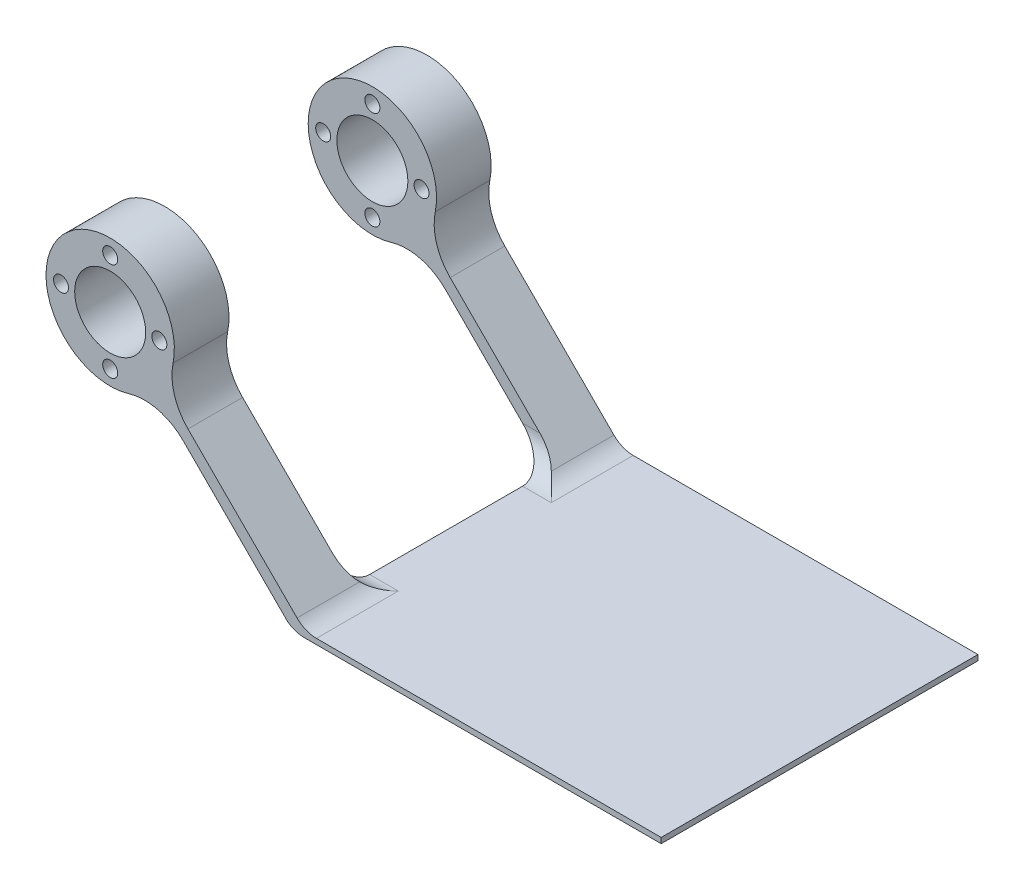
ISO-10303-21;
HEADER;
FILE_DESCRIPTION(('STEP AP214'),'2;1');
FILE_NAME('part.step','',(''),(''),'','','');
FILE_SCHEMA(('AUTOMOTIVE_DESIGN { 1 0 10303 214 1 1 1 1 }'));
ENDSEC;
DATA;
#1=APPLICATION_CONTEXT('core data for automotive mechanical design processes');
#2=APPLICATION_PROTOCOL_DEFINITION('international standard','automotive_design',2000,#1);
#3=PRODUCT_CONTEXT('',#1,'mechanical');
#4=PRODUCT('Part','Part','',(#3));
#5=PRODUCT_RELATED_PRODUCT_CATEGORY('part','',(#4));
#6=PRODUCT_DEFINITION_FORMATION('','',#4);
#7=PRODUCT_DEFINITION_CONTEXT('part definition',#1,'design');
#8=PRODUCT_DEFINITION('design','',#6,#7);
#9=PRODUCT_DEFINITION_SHAPE('','',#8);
#10=(LENGTH_UNIT() NAMED_UNIT(*) SI_UNIT(.MILLI.,.METRE.));
#11=(NAMED_UNIT(*) PLANE_ANGLE_UNIT() SI_UNIT($,.RADIAN.));
#12=(NAMED_UNIT(*) SI_UNIT($,.STERADIAN.) SOLID_ANGLE_UNIT());
#13=UNCERTAINTY_MEASURE_WITH_UNIT(LENGTH_MEASURE(1.E-05),#10,'distance_accuracy_value','');
#14=(GEOMETRIC_REPRESENTATION_CONTEXT(3) GLOBAL_UNCERTAINTY_ASSIGNED_CONTEXT((#13)) GLOBAL_UNIT_ASSIGNED_CONTEXT((#10,
#11,#12)) REPRESENTATION_CONTEXT('',''));
#15=CARTESIAN_POINT('',(0.,0.,0.));
#16=DIRECTION('',(0.,0.,1.));
#17=DIRECTION('',(1.,0.,0.));
#18=AXIS2_PLACEMENT_3D('',#15,#16,#17);
#19=CARTESIAN_POINT('',(-178.87788491269,85.7161894697562,58.));
#20=DIRECTION('',(0.,0.,-1.));
#21=DIRECTION('',(-1.,0.,0.));
#22=AXIS2_PLACEMENT_3D('',#19,#20,#21);
#23=CYLINDRICAL_SURFACE('',#22,2.75000000000001);
#24=CARTESIAN_POINT('',(-178.87788491269,85.7161894697562,-58.));
#25=DIRECTION('',(0.,0.,1.));
#26=DIRECTION('',(1.,0.,0.));
#27=AXIS2_PLACEMENT_3D('',#24,#25,#26);
#28=CIRCLE('',#27,2.75000000000001);
#29=CARTESIAN_POINT('',(-176.12788491269,85.7161894697562,-58.));
#30=VERTEX_POINT('',#29);
#31=EDGE_CURVE('E406',#30,#30,#28,.T.);
#32=ORIENTED_EDGE('',*,*,#31,.F.);
#33=EDGE_LOOP('',(#32));
#34=FACE_BOUND('',#33,.T.);
#35=CARTESIAN_POINT('',(-178.87788491269,85.7161894697562,-38.));
#36=DIRECTION('',(0.,0.,1.));
#37=DIRECTION('',(1.,0.,0.));
#38=AXIS2_PLACEMENT_3D('',#35,#36,#37);
#39=CIRCLE('',#38,2.75000000000001);
#40=CARTESIAN_POINT('',(-176.12788491269,85.7161894697562,-38.));
#41=VERTEX_POINT('',#40);
#42=EDGE_CURVE('E512',#41,#41,#39,.T.);
#43=ORIENTED_EDGE('',*,*,#42,.T.);
#44=EDGE_LOOP('',(#43));
#45=FACE_BOUND('',#44,.T.);
#46=ADVANCED_FACE('F50',(#34,#45),#23,.F.);
#47=CARTESIAN_POINT('',(-160.877883682054,67.7161882391197,58.));
#48=DIRECTION('',(0.,0.,-1.));
#49=DIRECTION('',(-1.,0.,0.));
#50=AXIS2_PLACEMENT_3D('',#47,#48,#49);
#51=CYLINDRICAL_SURFACE('',#50,2.75000000000001);
#52=CARTESIAN_POINT('',(-160.877883682054,67.7161882391197,-58.));
#53=DIRECTION('',(0.,0.,1.));
#54=DIRECTION('',(1.,0.,0.));
#55=AXIS2_PLACEMENT_3D('',#52,#53,#54);
#56=CIRCLE('',#55,2.75000000000001);
#57=CARTESIAN_POINT('',(-158.127883682054,67.7161882391197,-58.));
#58=VERTEX_POINT('',#57);
#59=EDGE_CURVE('E403',#58,#58,#56,.T.);
#60=ORIENTED_EDGE('',*,*,#59,.F.);
#61=EDGE_LOOP('',(#60));
#62=FACE_BOUND('',#61,.T.);
#63=CARTESIAN_POINT('',(-160.877883682054,67.7161882391197,-38.));
#64=DIRECTION('',(0.,0.,1.));
#65=DIRECTION('',(1.,0.,0.));
#66=AXIS2_PLACEMENT_3D('',#63,#64,#65);
#67=CIRCLE('',#66,2.75000000000001);
#68=CARTESIAN_POINT('',(-158.127883682054,67.7161882391197,-38.));
#69=VERTEX_POINT('',#68);
#70=EDGE_CURVE('E509',#69,#69,#67,.T.);
#71=ORIENTED_EDGE('',*,*,#70,.T.);
#72=EDGE_LOOP('',(#71));
#73=FACE_BOUND('',#72,.T.);
#74=ADVANCED_FACE('F356',(#62,#73),#51,.F.);
#75=CARTESIAN_POINT('',(-178.877882451739,49.7161894697563,58.));
#76=DIRECTION('',(0.,0.,-1.));
#77=DIRECTION('',(-1.,0.,0.));
#78=AXIS2_PLACEMENT_3D('',#75,#76,#77);
#79=CYLINDRICAL_SURFACE('',#78,2.75000000000001);
#80=CARTESIAN_POINT('',(-178.877882451739,49.7161894697563,-58.));
#81=DIRECTION('',(0.,0.,1.));
#82=DIRECTION('',(1.,0.,0.));
#83=AXIS2_PLACEMENT_3D('',#80,#81,#82);
#84=CIRCLE('',#83,2.75000000000001);
#85=CARTESIAN_POINT('',(-176.127882451739,49.7161894697563,-58.));
#86=VERTEX_POINT('',#85);
#87=EDGE_CURVE('E400',#86,#86,#84,.T.);
#88=ORIENTED_EDGE('',*,*,#87,.F.);
#89=EDGE_LOOP('',(#88));
#90=FACE_BOUND('',#89,.T.);
#91=CARTESIAN_POINT('',(-178.877882451739,49.7161894697563,-38.));
#92=DIRECTION('',(0.,0.,1.));
#93=DIRECTION('',(1.,0.,0.));
#94=AXIS2_PLACEMENT_3D('',#91,#92,#93);
#95=CIRCLE('',#94,2.75000000000001);
#96=CARTESIAN_POINT('',(-176.127882451739,49.7161894697563,-38.));
#97=VERTEX_POINT('',#96);
#98=EDGE_CURVE('E506',#97,#97,#95,.T.);
#99=ORIENTED_EDGE('',*,*,#98,.T.);
#100=EDGE_LOOP('',(#99));
#101=FACE_BOUND('',#100,.T.);
#102=ADVANCED_FACE('F363',(#90,#101),#79,.F.);
#103=CARTESIAN_POINT('',(-178.877883682054,67.7161894697563,58.));
#104=DIRECTION('',(0.,0.,-1.));
#105=DIRECTION('',(-1.,0.,0.));
#106=AXIS2_PLACEMENT_3D('',#103,#104,#105);
#107=CYLINDRICAL_SURFACE('',#106,13.);
#108=CARTESIAN_POINT('',(-178.877883682054,67.7161894697563,-58.));
#109=DIRECTION('',(0.,0.,1.));
#110=DIRECTION('',(1.,0.,0.));
#111=AXIS2_PLACEMENT_3D('',#108,#109,#110);
#112=CIRCLE('',#111,13.);
#113=CARTESIAN_POINT('',(-165.877883682054,67.7161894697563,-58.));
#114=VERTEX_POINT('',#113);
#115=EDGE_CURVE('E397',#114,#114,#112,.T.);
#116=ORIENTED_EDGE('',*,*,#115,.F.);
#117=EDGE_LOOP('',(#116));
#118=FACE_BOUND('',#117,.T.);
#119=CARTESIAN_POINT('',(-178.877883682054,67.7161894697563,-38.));
#120=DIRECTION('',(0.,0.,1.));
#121=DIRECTION('',(1.,0.,0.));
#122=AXIS2_PLACEMENT_3D('',#119,#120,#121);
#123=CIRCLE('',#122,13.);
#124=CARTESIAN_POINT('',(-165.877883682054,67.7161894697563,-38.));
#125=VERTEX_POINT('',#124);
#126=EDGE_CURVE('E499',#125,#125,#123,.T.);
#127=ORIENTED_EDGE('',*,*,#126,.T.);
#128=EDGE_LOOP('',(#127));
#129=FACE_BOUND('',#128,.T.);
#130=ADVANCED_FACE('F692',(#118,#129),#107,.F.);
#131=CARTESIAN_POINT('',(-178.877883682054,67.7161894697563,58.));
#132=DIRECTION('',(0.,0.,-1.));
#133=DIRECTION('',(-1.,0.,0.));
#134=AXIS2_PLACEMENT_3D('',#131,#132,#133);
#135=CYLINDRICAL_SURFACE('',#134,23.5);
#136=CARTESIAN_POINT('',(-178.877883682054,67.7161894697563,-38.));
#137=DIRECTION('',(0.,0.,1.));
#138=DIRECTION('',(1.,0.,0.));
#139=AXIS2_PLACEMENT_3D('',#136,#137,#138);
#140=CIRCLE('',#139,23.5);
#141=CARTESIAN_POINT('',(-155.851600556006,63.0214812361088,-38.));
#142=VERTEX_POINT('',#141);
#143=CARTESIAN_POINT('',(-172.056221602151,45.2280831362383,-38.));
#144=VERTEX_POINT('',#143);
#145=EDGE_CURVE('E495',#142,#144,#140,.T.);
#146=ORIENTED_EDGE('',*,*,#145,.F.);
#147=DIRECTION('',(0.,0.,-1.));
#148=VECTOR('',#147,1.);
#149=CARTESIAN_POINT('',(-155.851600556006,63.0214812361088,58.));
#150=LINE('',#149,#148);
#151=CARTESIAN_POINT('',(-155.851600556006,63.0214812361088,-58.));
#152=VERTEX_POINT('',#151);
#153=EDGE_CURVE('E297',#142,#152,#150,.T.);
#154=ORIENTED_EDGE('',*,*,#153,.T.);
#155=CARTESIAN_POINT('',(-178.877883682054,67.7161894697563,-58.));
#156=DIRECTION('',(0.,0.,1.));
#157=DIRECTION('',(1.,0.,0.));
#158=AXIS2_PLACEMENT_3D('',#155,#156,#157);
#159=CIRCLE('',#158,23.5);
#160=CARTESIAN_POINT('',(-172.056221602151,45.2280831362383,-58.));
#161=VERTEX_POINT('',#160);
#162=EDGE_CURVE('E290',#152,#161,#159,.T.);
#163=ORIENTED_EDGE('',*,*,#162,.T.);
#164=DIRECTION('',(0.,0.,-1.));
#165=VECTOR('',#164,1.);
#166=CARTESIAN_POINT('',(-172.056221602151,45.2280831362383,58.));
#167=LINE('',#166,#165);
#168=EDGE_CURVE('E299',#161,#144,#167,.F.);
#169=ORIENTED_EDGE('',*,*,#168,.T.);
#170=EDGE_LOOP('',(#146,#154,#163,#169));
#171=FACE_BOUND('',#170,.T.);
#172=ADVANCED_FACE('F379',(#171),#135,.T.);
#173=CARTESIAN_POINT('',(-196.877883682054,67.7161907000702,58.));
#174=DIRECTION('',(0.,0.,-1.));
#175=DIRECTION('',(-1.,0.,0.));
#176=AXIS2_PLACEMENT_3D('',#173,#174,#175);
#177=CYLINDRICAL_SURFACE('',#176,2.75000000000001);
#178=CARTESIAN_POINT('',(-196.877883682054,67.7161907000702,-58.));
#179=DIRECTION('',(0.,0.,1.));
#180=DIRECTION('',(1.,0.,0.));
#181=AXIS2_PLACEMENT_3D('',#178,#179,#180);
#182=CIRCLE('',#181,2.75000000000001);
#183=CARTESIAN_POINT('',(-194.127883682054,67.7161907000702,-58.));
#184=VERTEX_POINT('',#183);
#185=EDGE_CURVE('E409',#184,#184,#182,.T.);
#186=ORIENTED_EDGE('',*,*,#185,.F.);
#187=EDGE_LOOP('',(#186));
#188=FACE_BOUND('',#187,.T.);
#189=CARTESIAN_POINT('',(-196.877883682054,67.7161907000702,-38.));
#190=DIRECTION('',(0.,0.,1.));
#191=DIRECTION('',(1.,0.,0.));
#192=AXIS2_PLACEMENT_3D('',#189,#190,#191);
#193=CIRCLE('',#192,2.75000000000001);
#194=CARTESIAN_POINT('',(-194.127883682054,67.7161907000702,-38.));
#195=VERTEX_POINT('',#194);
#196=EDGE_CURVE('E496',#195,#195,#193,.T.);
#197=ORIENTED_EDGE('',*,*,#196,.T.);
#198=EDGE_LOOP('',(#197));
#199=FACE_BOUND('',#198,.T.);
#200=ADVANCED_FACE('F371',(#188,#199),#177,.F.);
#201=CARTESIAN_POINT('',(-178.87788491269,85.7161894697562,58.));
#202=DIRECTION('',(0.,0.,1.));
#203=DIRECTION('',(1.,0.,0.));
#204=AXIS2_PLACEMENT_3D('',#201,#202,#203);
#205=CIRCLE('',#204,2.75000000000001);
#206=CARTESIAN_POINT('',(-176.12788491269,85.7161894697562,58.));
#207=VERTEX_POINT('',#206);
#208=EDGE_CURVE('E385',#207,#207,#205,.T.);
#209=ORIENTED_EDGE('',*,*,#208,.T.);
#210=EDGE_LOOP('',(#209));
#211=FACE_BOUND('',#210,.T.);
#212=CARTESIAN_POINT('',(-178.87788491269,85.7161894697562,38.));
#213=DIRECTION('',(0.,0.,-1.));
#214=DIRECTION('',(-1.,0.,0.));
#215=AXIS2_PLACEMENT_3D('',#212,#213,#214);
#216=CIRCLE('',#215,2.75000000000001);
#217=CARTESIAN_POINT('',(-181.62788491269,85.7161894697562,38.));
#218=VERTEX_POINT('',#217);
#219=EDGE_CURVE('E291',#218,#218,#216,.T.);
#220=ORIENTED_EDGE('',*,*,#219,.T.);
#221=EDGE_LOOP('',(#220));
#222=FACE_BOUND('',#221,.T.);
#223=ADVANCED_FACE('F359',(#211,#222),#23,.F.);
#224=CARTESIAN_POINT('',(-160.877883682054,67.7161882391197,58.));
#225=DIRECTION('',(0.,0.,1.));
#226=DIRECTION('',(1.,0.,0.));
#227=AXIS2_PLACEMENT_3D('',#224,#225,#226);
#228=CIRCLE('',#227,2.75000000000001);
#229=CARTESIAN_POINT('',(-158.127883682054,67.7161882391197,58.));
#230=VERTEX_POINT('',#229);
#231=EDGE_CURVE('E430',#230,#230,#228,.T.);
#232=ORIENTED_EDGE('',*,*,#231,.T.);
#233=EDGE_LOOP('',(#232));
#234=FACE_BOUND('',#233,.T.);
#235=CARTESIAN_POINT('',(-160.877883682054,67.7161882391197,38.));
#236=DIRECTION('',(0.,0.,-1.));
#237=DIRECTION('',(-1.,0.,0.));
#238=AXIS2_PLACEMENT_3D('',#235,#236,#237);
#239=CIRCLE('',#238,2.75000000000001);
#240=CARTESIAN_POINT('',(-163.627883682054,67.7161882391197,38.));
#241=VERTEX_POINT('',#240);
#242=EDGE_CURVE('E388',#241,#241,#239,.T.);
#243=ORIENTED_EDGE('',*,*,#242,.T.);
#244=EDGE_LOOP('',(#243));
#245=FACE_BOUND('',#244,.T.);
#246=ADVANCED_FACE('F366',(#234,#245),#51,.F.);
#247=CARTESIAN_POINT('',(-178.877882451739,49.7161894697563,58.));
#248=DIRECTION('',(0.,0.,1.));
#249=DIRECTION('',(1.,0.,0.));
#250=AXIS2_PLACEMENT_3D('',#247,#248,#249);
#251=CIRCLE('',#250,2.75000000000001);
#252=CARTESIAN_POINT('',(-176.127882451739,49.7161894697563,58.));
#253=VERTEX_POINT('',#252);
#254=EDGE_CURVE('E427',#253,#253,#251,.T.);
#255=ORIENTED_EDGE('',*,*,#254,.T.);
#256=EDGE_LOOP('',(#255));
#257=FACE_BOUND('',#256,.T.);
#258=CARTESIAN_POINT('',(-178.877882451739,49.7161894697563,38.));
#259=DIRECTION('',(0.,0.,-1.));
#260=DIRECTION('',(-1.,0.,0.));
#261=AXIS2_PLACEMENT_3D('',#258,#259,#260);
#262=CIRCLE('',#261,2.75000000000001);
#263=CARTESIAN_POINT('',(-181.62788245174,49.7161894697563,38.));
#264=VERTEX_POINT('',#263);
#265=EDGE_CURVE('E391',#264,#264,#262,.T.);
#266=ORIENTED_EDGE('',*,*,#265,.T.);
#267=EDGE_LOOP('',(#266));
#268=FACE_BOUND('',#267,.T.);
#269=ADVANCED_FACE('F377',(#257,#268),#79,.F.);
#270=CARTESIAN_POINT('',(-178.877883682054,67.7161894697563,58.));
#271=DIRECTION('',(0.,0.,1.));
#272=DIRECTION('',(1.,0.,0.));
#273=AXIS2_PLACEMENT_3D('',#270,#271,#272);
#274=CIRCLE('',#273,13.);
#275=CARTESIAN_POINT('',(-165.877883682054,67.7161894697563,58.));
#276=VERTEX_POINT('',#275);
#277=EDGE_CURVE('E424',#276,#276,#274,.T.);
#278=ORIENTED_EDGE('',*,*,#277,.T.);
#279=EDGE_LOOP('',(#278));
#280=FACE_BOUND('',#279,.T.);
#281=CARTESIAN_POINT('',(-178.877883682054,67.7161894697563,38.));
#282=DIRECTION('',(0.,0.,-1.));
#283=DIRECTION('',(-1.,0.,0.));
#284=AXIS2_PLACEMENT_3D('',#281,#282,#283);
#285=CIRCLE('',#284,13.);
#286=CARTESIAN_POINT('',(-191.877883682054,67.7161894697563,38.));
#287=VERTEX_POINT('',#286);
#288=EDGE_CURVE('E519',#287,#287,#285,.T.);
#289=ORIENTED_EDGE('',*,*,#288,.T.);
#290=EDGE_LOOP('',(#289));
#291=FACE_BOUND('',#290,.T.);
#292=ADVANCED_FACE('F540',(#280,#291),#107,.F.);
#293=CARTESIAN_POINT('',(-178.877883682054,67.7161894697563,38.));
#294=DIRECTION('',(0.,0.,-1.));
#295=DIRECTION('',(-1.,0.,0.));
#296=AXIS2_PLACEMENT_3D('',#293,#294,#295);
#297=CIRCLE('',#296,23.5);
#298=CARTESIAN_POINT('',(-172.056221602151,45.2280831362383,38.));
#299=VERTEX_POINT('',#298);
#300=CARTESIAN_POINT('',(-155.851600556006,63.0214812361088,38.));
#301=VERTEX_POINT('',#300);
#302=EDGE_CURVE('E334',#299,#301,#297,.T.);
#303=ORIENTED_EDGE('',*,*,#302,.F.);
#304=DIRECTION('',(0.,0.,-1.));
#305=VECTOR('',#304,1.);
#306=CARTESIAN_POINT('',(-172.056221602151,45.2280831362383,58.));
#307=LINE('',#306,#305);
#308=CARTESIAN_POINT('',(-172.056221602151,45.2280831362383,58.));
#309=VERTEX_POINT('',#308);
#310=EDGE_CURVE('E302',#299,#309,#307,.F.);
#311=ORIENTED_EDGE('',*,*,#310,.T.);
#312=CARTESIAN_POINT('',(-178.877883682054,67.7161894697563,58.));
#313=DIRECTION('',(0.,0.,1.));
#314=DIRECTION('',(1.,0.,0.));
#315=AXIS2_PLACEMENT_3D('',#312,#313,#314);
#316=CIRCLE('',#315,23.5);
#317=CARTESIAN_POINT('',(-155.851600556006,63.0214812361088,58.));
#318=VERTEX_POINT('',#317);
#319=EDGE_CURVE('E418',#318,#309,#316,.T.);
#320=ORIENTED_EDGE('',*,*,#319,.F.);
#321=DIRECTION('',(0.,0.,-1.));
#322=VECTOR('',#321,1.);
#323=CARTESIAN_POINT('',(-155.851600556006,63.0214812361088,58.));
#324=LINE('',#323,#322);
#325=EDGE_CURVE('E294',#318,#301,#324,.T.);
#326=ORIENTED_EDGE('',*,*,#325,.T.);
#327=EDGE_LOOP('',(#303,#311,#320,#326));
#328=FACE_BOUND('',#327,.T.);
#329=ADVANCED_FACE('F533',(#328),#135,.T.);
#330=CARTESIAN_POINT('',(-196.877883682054,67.7161907000702,58.));
#331=DIRECTION('',(0.,0.,1.));
#332=DIRECTION('',(1.,0.,0.));
#333=AXIS2_PLACEMENT_3D('',#330,#331,#332);
#334=CIRCLE('',#333,2.75000000000001);
#335=CARTESIAN_POINT('',(-194.127883682054,67.7161907000702,58.));
#336=VERTEX_POINT('',#335);
#337=EDGE_CURVE('E434',#336,#336,#334,.T.);
#338=ORIENTED_EDGE('',*,*,#337,.T.);
#339=EDGE_LOOP('',(#338));
#340=FACE_BOUND('',#339,.T.);
#341=CARTESIAN_POINT('',(-196.877883682054,67.7161907000702,38.));
#342=DIRECTION('',(0.,0.,-1.));
#343=DIRECTION('',(-1.,0.,0.));
#344=AXIS2_PLACEMENT_3D('',#341,#342,#343);
#345=CIRCLE('',#344,2.75000000000001);
#346=CARTESIAN_POINT('',(-199.627883682054,67.7161907000702,38.));
#347=VERTEX_POINT('',#346);
#348=EDGE_CURVE('E516',#347,#347,#345,.T.);
#349=ORIENTED_EDGE('',*,*,#348,.T.);
#350=EDGE_LOOP('',(#349));
#351=FACE_BOUND('',#350,.T.);
#352=ADVANCED_FACE('F381',(#340,#351),#177,.F.);
#353=CARTESIAN_POINT('',(-104.204998804833,2.,-13.7426971214017));
#354=DIRECTION('',(0.,1.,0.));
#355=DIRECTION('',(0.,0.,1.));
#356=AXIS2_PLACEMENT_3D('',#353,#354,#355);
#357=PLANE('',#356);
#358=DIRECTION('',(0.,0.,1.));
#359=VECTOR('',#358,1.);
#360=CARTESIAN_POINT('',(-113.87701126408,2.,58.));
#361=LINE('',#360,#359);
#362=CARTESIAN_POINT('',(-113.87701126408,2.,-28.));
#363=VERTEX_POINT('',#362);
#364=CARTESIAN_POINT('',(-113.87701126408,2.,22.8031981799006));
#365=VERTEX_POINT('',#364);
#366=EDGE_CURVE('E230',#363,#365,#361,.T.);
#367=ORIENTED_EDGE('',*,*,#366,.T.);
#368=CARTESIAN_POINT('',(-113.87701126408,2.,28.));
#369=VERTEX_POINT('',#368);
#370=EDGE_CURVE('E237',#365,#369,#361,.T.);
#371=ORIENTED_EDGE('',*,*,#370,.T.);
#372=DIRECTION('',(1.,0.,0.));
#373=VECTOR('',#372,1.);
#374=CARTESIAN_POINT('',(-104.204998804833,2.,28.));
#375=LINE('',#374,#373);
#376=CARTESIAN_POINT('',(-103.37091460967,2.,28.));
#377=VERTEX_POINT('',#376);
#378=EDGE_CURVE('E259',#369,#377,#375,.T.);
#379=ORIENTED_EDGE('',*,*,#378,.T.);
#380=DIRECTION('',(0.,0.,1.));
#381=VECTOR('',#380,1.);
#382=CARTESIAN_POINT('',(-103.37091460967,2.,58.));
#383=LINE('',#382,#381);
#384=CARTESIAN_POINT('',(-103.37091460967,2.,58.));
#385=VERTEX_POINT('',#384);
#386=EDGE_CURVE('E269',#377,#385,#383,.T.);
#387=ORIENTED_EDGE('',*,*,#386,.T.);
#388=DIRECTION('',(1.,0.,0.));
#389=VECTOR('',#388,1.);
#390=CARTESIAN_POINT('',(113.87701126408,2.,58.));
#391=LINE('',#390,#389);
#392=CARTESIAN_POINT('',(22.8770112640801,2.,58.));
#393=VERTEX_POINT('',#392);
#394=EDGE_CURVE('E236',#385,#393,#391,.T.);
#395=ORIENTED_EDGE('',*,*,#394,.T.);
#396=DIRECTION('',(0.,0.,1.));
#397=VECTOR('',#396,1.);
#398=CARTESIAN_POINT('',(22.8770112640801,2.,58.));
#399=LINE('',#398,#397);
#400=CARTESIAN_POINT('',(22.8770112640801,2.,-58.));
#401=VERTEX_POINT('',#400);
#402=EDGE_CURVE('E200',#401,#393,#399,.T.);
#403=ORIENTED_EDGE('',*,*,#402,.F.);
#404=DIRECTION('',(-1.,0.,0.));
#405=VECTOR('',#404,1.);
#406=CARTESIAN_POINT('',(-113.87701126408,2.,-58.));
#407=LINE('',#406,#405);
#408=CARTESIAN_POINT('',(-103.37091460967,2.,-58.));
#409=VERTEX_POINT('',#408);
#410=EDGE_CURVE('E214',#401,#409,#407,.T.);
#411=ORIENTED_EDGE('',*,*,#410,.T.);
#412=DIRECTION('',(0.,0.,-1.));
#413=VECTOR('',#412,1.);
#414=CARTESIAN_POINT('',(-103.37091460967,2.,-13.7426971214017));
#415=LINE('',#414,#413);
#416=CARTESIAN_POINT('',(-103.37091460967,2.,-28.));
#417=VERTEX_POINT('',#416);
#418=EDGE_CURVE('E233',#409,#417,#415,.F.);
#419=ORIENTED_EDGE('',*,*,#418,.T.);
#420=DIRECTION('',(-1.,0.,0.));
#421=VECTOR('',#420,1.);
#422=CARTESIAN_POINT('',(-104.204998804833,2.,-28.));
#423=LINE('',#422,#421);
#424=EDGE_CURVE('E222',#417,#363,#423,.T.);
#425=ORIENTED_EDGE('',*,*,#424,.T.);
#426=EDGE_LOOP('',(#367,#371,#379,#387,#395,#403,#411,#419,#425));
#427=FACE_BOUND('',#426,.T.);
#428=ADVANCED_FACE('F229',(#427),#357,.T.);
#429=CARTESIAN_POINT('',(-113.87701126408,2.,38.));
#430=DIRECTION('',(-0.707106781186543,-0.707106781186552,0.));
#431=DIRECTION('',(0.707106781186552,-0.707106781186543,0.));
#432=AXIS2_PLACEMENT_3D('',#429,#430,#431);
#433=PLANE('',#432);
#434=DIRECTION('',(0.707106781186552,-0.707106781186543,0.));
#435=VECTOR('',#434,1.);
#436=CARTESIAN_POINT('',(-113.87701126408,2.,58.));
#437=LINE('',#436,#435);
#438=CARTESIAN_POINT('',(-152.108416123184,40.231404859103,58.));
#439=VERTEX_POINT('',#438);
#440=CARTESIAN_POINT('',(-113.87701126408,2.,58.));
#441=VERTEX_POINT('',#440);
#442=EDGE_CURVE('E341',#439,#441,#437,.T.);
#443=ORIENTED_EDGE('',*,*,#442,.F.);
#444=DIRECTION('',(0.,0.,-1.));
#445=VECTOR('',#444,1.);
#446=CARTESIAN_POINT('',(-152.108416123184,40.231404859103,38.));
#447=LINE('',#446,#445);
#448=CARTESIAN_POINT('',(-152.108416123184,40.231404859103,38.));
#449=VERTEX_POINT('',#448);
#450=EDGE_CURVE('E287',#439,#449,#447,.T.);
#451=ORIENTED_EDGE('',*,*,#450,.T.);
#452=DIRECTION('',(0.707106781186552,-0.707106781186543,0.));
#453=VECTOR('',#452,1.);
#454=CARTESIAN_POINT('',(-113.87701126408,2.,38.));
#455=LINE('',#454,#453);
#456=CARTESIAN_POINT('',(-123.87701126408,12.,38.));
#457=VERTEX_POINT('',#456);
#458=EDGE_CURVE('E340',#449,#457,#455,.T.);
#459=ORIENTED_EDGE('',*,*,#458,.T.);
#460=CARTESIAN_POINT('',(-123.87701126408,12.,28.));
#461=DIRECTION('',(-0.707106781186543,-0.707106781186552,0.));
#462=DIRECTION('',(0.707106781186552,-0.707106781186543,0.));
#463=AXIS2_PLACEMENT_3D('',#460,#461,#462);
#464=ELLIPSE('',#463,14.142135623731,10.);
#465=EDGE_CURVE('E266',#457,#369,#464,.F.);
#466=ORIENTED_EDGE('',*,*,#465,.T.);
#467=DIRECTION('',(0.,0.,1.));
#468=VECTOR('',#467,1.);
#469=CARTESIAN_POINT('',(-113.87701126408,2.,38.));
#470=LINE('',#469,#468);
#471=EDGE_CURVE('E243',#369,#441,#470,.T.);
#472=ORIENTED_EDGE('',*,*,#471,.T.);
#473=EDGE_LOOP('',(#443,#451,#459,#466,#472));
#474=FACE_BOUND('',#473,.T.);
#475=ADVANCED_FACE('F453',(#474),#433,.T.);
#476=CARTESIAN_POINT('',(-165.695030748741,60.1819805153389,38.));
#477=DIRECTION('',(0.707106781186543,0.707106781186552,0.));
#478=DIRECTION('',(-0.707106781186552,0.707106781186543,0.));
#479=AXIS2_PLACEMENT_3D('',#476,#477,#478);
#480=PLANE('',#479);
#481=DIRECTION('',(-0.707106781186552,0.707106781186543,0.));
#482=VECTOR('',#481,1.);
#483=CARTESIAN_POINT('',(-165.695030748741,60.1819805153389,38.));
#484=LINE('',#483,#482);
#485=CARTESIAN_POINT('',(-117.513050233401,12.,38.));
#486=VERTEX_POINT('',#485);
#487=CARTESIAN_POINT('',(-150.396899476718,44.883849243316,38.));
#488=VERTEX_POINT('',#487);
#489=EDGE_CURVE('E331',#486,#488,#484,.T.);
#490=ORIENTED_EDGE('',*,*,#489,.T.);
#491=DIRECTION('',(0.,0.,-1.));
#492=VECTOR('',#491,1.);
#493=CARTESIAN_POINT('',(-150.396899476718,44.883849243316,38.));
#494=LINE('',#493,#492);
#495=CARTESIAN_POINT('',(-150.396899476718,44.883849243316,58.));
#496=VERTEX_POINT('',#495);
#497=EDGE_CURVE('E309',#488,#496,#494,.F.);
#498=ORIENTED_EDGE('',*,*,#497,.T.);
#499=DIRECTION('',(-0.707106781186552,0.707106781186543,0.));
#500=VECTOR('',#499,1.);
#501=CARTESIAN_POINT('',(-165.695030748741,60.1819805153389,58.));
#502=LINE('',#501,#500);
#503=CARTESIAN_POINT('',(-110.441982421536,4.92893218813449,58.));
#504=VERTEX_POINT('',#503);
#505=EDGE_CURVE('E436',#504,#496,#502,.T.);
#506=ORIENTED_EDGE('',*,*,#505,.F.);
#507=DIRECTION('',(0.,0.,1.));
#508=VECTOR('',#507,1.);
#509=CARTESIAN_POINT('',(-110.441982421536,4.92893218813449,28.));
#510=LINE('',#509,#508);
#511=CARTESIAN_POINT('',(-110.441982421536,4.92893218813449,35.0710678118654));
#512=VERTEX_POINT('',#511);
#513=EDGE_CURVE('E272',#504,#512,#510,.F.);
#514=ORIENTED_EDGE('',*,*,#513,.T.);
#515=CARTESIAN_POINT('',(-117.513050233401,12.,28.));
#516=DIRECTION('',(0.707106781186543,0.707106781186552,0.));
#517=DIRECTION('',(0.707106781186552,-0.707106781186543,0.));
#518=AXIS2_PLACEMENT_3D('',#515,#516,#517);
#519=ELLIPSE('',#518,14.142135623731,10.);
#520=EDGE_CURVE('E264',#512,#486,#519,.F.);
#521=ORIENTED_EDGE('',*,*,#520,.T.);
#522=EDGE_LOOP('',(#490,#498,#506,#514,#521));
#523=FACE_BOUND('',#522,.T.);
#524=ADVANCED_FACE('F336',(#523),#480,.T.);
#525=CARTESIAN_POINT('',(113.87701126408,2.,58.));
#526=DIRECTION('',(0.,0.,-1.));
#527=DIRECTION('',(-1.,0.,0.));
#528=AXIS2_PLACEMENT_3D('',#525,#526,#527);
#529=PLANE('',#528);
#530=DIRECTION('',(1.,0.,0.));
#531=VECTOR('',#530,1.);
#532=CARTESIAN_POINT('',(113.87701126408,0.,58.));
#533=LINE('',#532,#531);
#534=CARTESIAN_POINT('',(-107.87701126408,0.,58.));
#535=VERTEX_POINT('',#534);
#536=CARTESIAN_POINT('',(22.8770112640801,0.,58.));
#537=VERTEX_POINT('',#536);
#538=EDGE_CURVE('E247',#535,#537,#533,.T.);
#539=ORIENTED_EDGE('',*,*,#538,.T.);
#540=DIRECTION('',(0.,1.,0.));
#541=VECTOR('',#540,1.);
#542=CARTESIAN_POINT('',(22.8770112640801,-147.434731322033,58.));
#543=LINE('',#542,#541);
#544=EDGE_CURVE('E65',#537,#393,#543,.T.);
#545=ORIENTED_EDGE('',*,*,#544,.T.);
#546=ORIENTED_EDGE('',*,*,#394,.F.);
#547=CARTESIAN_POINT('',(-103.37091460967,12.,58.));
#548=DIRECTION('',(0.,0.,-1.));
#549=DIRECTION('',(-1.,0.,0.));
#550=AXIS2_PLACEMENT_3D('',#547,#548,#549);
#551=CIRCLE('',#550,10.);
#552=EDGE_CURVE('E274',#385,#504,#551,.T.);
#553=ORIENTED_EDGE('',*,*,#552,.T.);
#554=ORIENTED_EDGE('',*,*,#505,.T.);
#555=CARTESIAN_POINT('',(-136.254763852987,59.0259848670471,58.));
#556=DIRECTION('',(0.,0.,-1.));
#557=DIRECTION('',(-1.,0.,0.));
#558=AXIS2_PLACEMENT_3D('',#555,#556,#557);
#559=CIRCLE('',#558,20.);
#560=EDGE_CURVE('E73',#496,#318,#559,.T.);
#561=ORIENTED_EDGE('',*,*,#560,.T.);
#562=ORIENTED_EDGE('',*,*,#319,.T.);
#563=CARTESIAN_POINT('',(-166.250551746914,26.089269235372,58.));
#564=DIRECTION('',(0.,0.,-1.));
#565=DIRECTION('',(-1.,0.,0.));
#566=AXIS2_PLACEMENT_3D('',#563,#564,#565);
#567=CIRCLE('',#566,20.);
#568=EDGE_CURVE('E313',#309,#439,#567,.T.);
#569=ORIENTED_EDGE('',*,*,#568,.T.);
#570=ORIENTED_EDGE('',*,*,#442,.T.);
#571=CARTESIAN_POINT('',(-107.87701126408,10.,58.));
#572=DIRECTION('',(0.,0.,-1.));
#573=DIRECTION('',(-1.,0.,0.));
#574=AXIS2_PLACEMENT_3D('',#571,#572,#573);
#575=CIRCLE('',#574,10.);
#576=EDGE_CURVE('E257',#441,#535,#575,.F.);
#577=ORIENTED_EDGE('',*,*,#576,.T.);
#578=EDGE_LOOP('',(#539,#545,#546,#553,#554,#561,#562,#569,#570,#577));
#579=FACE_BOUND('',#578,.T.);
#580=ORIENTED_EDGE('',*,*,#277,.F.);
#581=EDGE_LOOP('',(#580));
#582=FACE_BOUND('',#581,.T.);
#583=ORIENTED_EDGE('',*,*,#254,.F.);
#584=EDGE_LOOP('',(#583));
#585=FACE_BOUND('',#584,.T.);
#586=ORIENTED_EDGE('',*,*,#231,.F.);
#587=EDGE_LOOP('',(#586));
#588=FACE_BOUND('',#587,.T.);
#589=ORIENTED_EDGE('',*,*,#208,.F.);
#590=EDGE_LOOP('',(#589));
#591=FACE_BOUND('',#590,.T.);
#592=ORIENTED_EDGE('',*,*,#337,.F.);
#593=EDGE_LOOP('',(#592));
#594=FACE_BOUND('',#593,.T.);
#595=ADVANCED_FACE('F442',(#579,#582,#585,#588,#591,#594),#529,.F.);
#596=CARTESIAN_POINT('',(-113.87701126408,2.,-58.));
#597=DIRECTION('',(0.,0.,1.));
#598=DIRECTION('',(1.,0.,0.));
#599=AXIS2_PLACEMENT_3D('',#596,#597,#598);
#600=PLANE('',#599);
#601=ORIENTED_EDGE('',*,*,#410,.F.);
#602=DIRECTION('',(0.,1.,0.));
#603=VECTOR('',#602,1.);
#604=CARTESIAN_POINT('',(22.8770112640801,-147.434731322033,-58.));
#605=LINE('',#604,#603);
#606=CARTESIAN_POINT('',(22.8770112640801,0.,-58.));
#607=VERTEX_POINT('',#606);
#608=EDGE_CURVE('E466',#607,#401,#605,.T.);
#609=ORIENTED_EDGE('',*,*,#608,.F.);
#610=DIRECTION('',(-1.,0.,0.));
#611=VECTOR('',#610,1.);
#612=CARTESIAN_POINT('',(-113.87701126408,0.,-58.));
#613=LINE('',#612,#611);
#614=CARTESIAN_POINT('',(-107.87701126408,0.,-58.));
#615=VERTEX_POINT('',#614);
#616=EDGE_CURVE('E241',#607,#615,#613,.T.);
#617=ORIENTED_EDGE('',*,*,#616,.T.);
#618=CARTESIAN_POINT('',(-107.87701126408,10.,-58.));
#619=DIRECTION('',(0.,0.,1.));
#620=DIRECTION('',(1.,0.,0.));
#621=AXIS2_PLACEMENT_3D('',#618,#619,#620);
#622=CIRCLE('',#621,10.);
#623=CARTESIAN_POINT('',(-113.87701126408,2.,-58.));
#624=VERTEX_POINT('',#623);
#625=EDGE_CURVE('E255',#615,#624,#622,.F.);
#626=ORIENTED_EDGE('',*,*,#625,.T.);
#627=DIRECTION('',(0.707106781186552,-0.707106781186543,0.));
#628=VECTOR('',#627,1.);
#629=CARTESIAN_POINT('',(-113.87701126408,2.,-58.));
#630=LINE('',#629,#628);
#631=CARTESIAN_POINT('',(-152.108416123184,40.231404859103,-58.));
#632=VERTEX_POINT('',#631);
#633=EDGE_CURVE('E211',#632,#624,#630,.T.);
#634=ORIENTED_EDGE('',*,*,#633,.F.);
#635=CARTESIAN_POINT('',(-166.250551746914,26.089269235372,-58.));
#636=DIRECTION('',(0.,0.,1.));
#637=DIRECTION('',(1.,0.,0.));
#638=AXIS2_PLACEMENT_3D('',#635,#636,#637);
#639=CIRCLE('',#638,20.);
#640=EDGE_CURVE('E315',#632,#161,#639,.T.);
#641=ORIENTED_EDGE('',*,*,#640,.T.);
#642=ORIENTED_EDGE('',*,*,#162,.F.);
#643=CARTESIAN_POINT('',(-136.254763852987,59.0259848670471,-58.));
#644=DIRECTION('',(0.,0.,1.));
#645=DIRECTION('',(1.,0.,0.));
#646=AXIS2_PLACEMENT_3D('',#643,#644,#645);
#647=CIRCLE('',#646,20.);
#648=CARTESIAN_POINT('',(-150.396899476718,44.883849243316,-58.));
#649=VERTEX_POINT('',#648);
#650=EDGE_CURVE('E321',#152,#649,#647,.T.);
#651=ORIENTED_EDGE('',*,*,#650,.T.);
#652=DIRECTION('',(-0.707106781186552,0.707106781186543,0.));
#653=VECTOR('',#652,1.);
#654=CARTESIAN_POINT('',(-165.695030748741,60.1819805153389,-58.));
#655=LINE('',#654,#653);
#656=CARTESIAN_POINT('',(-110.441982421536,4.92893218813449,-58.));
#657=VERTEX_POINT('',#656);
#658=EDGE_CURVE('E415',#657,#649,#655,.T.);
#659=ORIENTED_EDGE('',*,*,#658,.F.);
#660=CARTESIAN_POINT('',(-103.37091460967,12.,-58.));
#661=DIRECTION('',(0.,0.,1.));
#662=DIRECTION('',(1.,0.,0.));
#663=AXIS2_PLACEMENT_3D('',#660,#661,#662);
#664=CIRCLE('',#663,10.);
#665=EDGE_CURVE('E284',#657,#409,#664,.T.);
#666=ORIENTED_EDGE('',*,*,#665,.T.);
#667=EDGE_LOOP('',(#601,#609,#617,#626,#634,#641,#642,#651,#659,#666));
#668=FACE_BOUND('',#667,.T.);
#669=ORIENTED_EDGE('',*,*,#185,.T.);
#670=EDGE_LOOP('',(#669));
#671=FACE_BOUND('',#670,.T.);
#672=ORIENTED_EDGE('',*,*,#31,.T.);
#673=EDGE_LOOP('',(#672));
#674=FACE_BOUND('',#673,.T.);
#675=ORIENTED_EDGE('',*,*,#59,.T.);
#676=EDGE_LOOP('',(#675));
#677=FACE_BOUND('',#676,.T.);
#678=ORIENTED_EDGE('',*,*,#87,.T.);
#679=EDGE_LOOP('',(#678));
#680=FACE_BOUND('',#679,.T.);
#681=ORIENTED_EDGE('',*,*,#115,.T.);
#682=EDGE_LOOP('',(#681));
#683=FACE_BOUND('',#682,.T.);
#684=ADVANCED_FACE('F473',(#668,#671,#674,#677,#680,#683),#600,.F.);
#685=CARTESIAN_POINT('',(-104.204998804833,0.,-13.7426971214017));
#686=DIRECTION('',(0.,1.,0.));
#687=DIRECTION('',(0.,0.,1.));
#688=AXIS2_PLACEMENT_3D('',#685,#686,#687);
#689=PLANE('',#688);
#690=DIRECTION('',(0.,0.,1.));
#691=VECTOR('',#690,1.);
#692=CARTESIAN_POINT('',(-107.87701126408,0.,-13.7426971214017));
#693=LINE('',#692,#691);
#694=CARTESIAN_POINT('',(-107.87701126408,0.,22.8031981799006));
#695=VERTEX_POINT('',#694);
#696=EDGE_CURVE('E213',#535,#695,#693,.F.);
#697=ORIENTED_EDGE('',*,*,#696,.T.);
#698=DIRECTION('',(0.,0.,-1.));
#699=VECTOR('',#698,1.);
#700=CARTESIAN_POINT('',(-107.87701126408,0.,-13.7426971214017));
#701=LINE('',#700,#699);
#702=CARTESIAN_POINT('',(-107.87701126408,0.,-28.));
#703=VERTEX_POINT('',#702);
#704=EDGE_CURVE('E12',#695,#703,#701,.T.);
#705=ORIENTED_EDGE('',*,*,#704,.T.);
#706=DIRECTION('',(0.,0.,1.));
#707=VECTOR('',#706,1.);
#708=CARTESIAN_POINT('',(-107.87701126408,0.,-13.7426971214017));
#709=LINE('',#708,#707);
#710=EDGE_CURVE('E196',#703,#615,#709,.F.);
#711=ORIENTED_EDGE('',*,*,#710,.T.);
#712=ORIENTED_EDGE('',*,*,#616,.F.);
#713=DIRECTION('',(0.,0.,-1.));
#714=VECTOR('',#713,1.);
#715=CARTESIAN_POINT('',(22.8770112640801,0.,58.));
#716=LINE('',#715,#714);
#717=EDGE_CURVE('E465',#537,#607,#716,.T.);
#718=ORIENTED_EDGE('',*,*,#717,.F.);
#719=ORIENTED_EDGE('',*,*,#538,.F.);
#720=EDGE_LOOP('',(#697,#705,#711,#712,#718,#719));
#721=FACE_BOUND('',#720,.T.);
#722=ADVANCED_FACE('F463',(#721),#689,.F.);
#723=CARTESIAN_POINT('',(-107.87701126408,10.,-16.2399999999999));
#724=DIRECTION('',(0.,0.,1.));
#725=DIRECTION('',(1.,0.,0.));
#726=AXIS2_PLACEMENT_3D('',#723,#724,#725);
#727=CYLINDRICAL_SURFACE('',#726,10.);
#728=CARTESIAN_POINT('',(-107.87701126408,10.,-28.));
#729=DIRECTION('',(0.,0.,-1.));
#730=DIRECTION('',(-1.,0.,0.));
#731=AXIS2_PLACEMENT_3D('',#728,#729,#730);
#732=CIRCLE('',#731,10.);
#733=EDGE_CURVE('E191',#363,#703,#732,.F.);
#734=ORIENTED_EDGE('',*,*,#733,.F.);
#735=DIRECTION('',(0.,0.,1.));
#736=VECTOR('',#735,1.);
#737=CARTESIAN_POINT('',(-113.87701126408,2.,-16.2399999999999));
#738=LINE('',#737,#736);
#739=EDGE_CURVE('E195',#624,#363,#738,.T.);
#740=ORIENTED_EDGE('',*,*,#739,.F.);
#741=ORIENTED_EDGE('',*,*,#625,.F.);
#742=ORIENTED_EDGE('',*,*,#710,.F.);
#743=EDGE_LOOP('',(#734,#740,#741,#742));
#744=FACE_BOUND('',#743,.T.);
#745=ADVANCED_FACE('F193',(#744),#727,.T.);
#746=CARTESIAN_POINT('',(-107.87701126408,10.,58.));
#747=DIRECTION('',(0.,0.,1.));
#748=DIRECTION('',(1.,0.,0.));
#749=AXIS2_PLACEMENT_3D('',#746,#747,#748);
#750=CYLINDRICAL_SURFACE('',#749,10.);
#751=CARTESIAN_POINT('',(-107.87701126408,10.,22.8031981799006));
#752=DIRECTION('',(0.,0.,1.));
#753=DIRECTION('',(1.,0.,0.));
#754=AXIS2_PLACEMENT_3D('',#751,#752,#753);
#755=CIRCLE('',#754,10.);
#756=EDGE_CURVE('E58',#695,#365,#755,.F.);
#757=ORIENTED_EDGE('',*,*,#756,.F.);
#758=ORIENTED_EDGE('',*,*,#696,.F.);
#759=ORIENTED_EDGE('',*,*,#576,.F.);
#760=ORIENTED_EDGE('',*,*,#471,.F.);
#761=ORIENTED_EDGE('',*,*,#370,.F.);
#762=EDGE_LOOP('',(#757,#758,#759,#760,#761));
#763=FACE_BOUND('',#762,.T.);
#764=ADVANCED_FACE('F452',(#763),#750,.T.);
#765=CARTESIAN_POINT('',(-107.87701126408,10.,38.));
#766=DIRECTION('',(0.,0.,1.));
#767=DIRECTION('',(1.,0.,0.));
#768=AXIS2_PLACEMENT_3D('',#765,#766,#767);
#769=PLANE('',#768);
#770=CARTESIAN_POINT('',(-166.250551746914,26.089269235372,38.));
#771=DIRECTION('',(0.,0.,1.));
#772=DIRECTION('',(1.,0.,0.));
#773=AXIS2_PLACEMENT_3D('',#770,#771,#772);
#774=CIRCLE('',#773,20.);
#775=EDGE_CURVE('E311',#449,#299,#774,.T.);
#776=ORIENTED_EDGE('',*,*,#775,.T.);
#777=ORIENTED_EDGE('',*,*,#302,.T.);
#778=CARTESIAN_POINT('',(-136.254763852987,59.0259848670471,38.));
#779=DIRECTION('',(0.,0.,1.));
#780=DIRECTION('',(1.,0.,0.));
#781=AXIS2_PLACEMENT_3D('',#778,#779,#780);
#782=CIRCLE('',#781,20.);
#783=EDGE_CURVE('E324',#301,#488,#782,.T.);
#784=ORIENTED_EDGE('',*,*,#783,.T.);
#785=ORIENTED_EDGE('',*,*,#489,.F.);
#786=DIRECTION('',(1.,0.,0.));
#787=VECTOR('',#786,1.);
#788=CARTESIAN_POINT('',(-107.87701126408,12.,38.));
#789=LINE('',#788,#787);
#790=EDGE_CURVE('E261',#486,#457,#789,.F.);
#791=ORIENTED_EDGE('',*,*,#790,.T.);
#792=ORIENTED_EDGE('',*,*,#458,.F.);
#793=EDGE_LOOP('',(#776,#777,#784,#785,#791,#792));
#794=FACE_BOUND('',#793,.T.);
#795=ORIENTED_EDGE('',*,*,#219,.F.);
#796=EDGE_LOOP('',(#795));
#797=FACE_BOUND('',#796,.T.);
#798=ORIENTED_EDGE('',*,*,#242,.F.);
#799=EDGE_LOOP('',(#798));
#800=FACE_BOUND('',#799,.T.);
#801=ORIENTED_EDGE('',*,*,#265,.F.);
#802=EDGE_LOOP('',(#801));
#803=FACE_BOUND('',#802,.T.);
#804=ORIENTED_EDGE('',*,*,#288,.F.);
#805=EDGE_LOOP('',(#804));
#806=FACE_BOUND('',#805,.T.);
#807=ORIENTED_EDGE('',*,*,#348,.F.);
#808=EDGE_LOOP('',(#807));
#809=FACE_BOUND('',#808,.T.);
#810=ADVANCED_FACE('F329',(#794,#797,#800,#803,#806,#809),#769,.F.);
#811=CARTESIAN_POINT('',(-104.204998804833,12.,28.));
#812=DIRECTION('',(1.,0.,0.));
#813=DIRECTION('',(0.,0.,-1.));
#814=AXIS2_PLACEMENT_3D('',#811,#812,#813);
#815=CYLINDRICAL_SURFACE('',#814,10.);
#816=ORIENTED_EDGE('',*,*,#465,.F.);
#817=ORIENTED_EDGE('',*,*,#790,.F.);
#818=ORIENTED_EDGE('',*,*,#520,.F.);
#819=CARTESIAN_POINT('',(-103.37091460967,12.,28.));
#820=DIRECTION('',(0.707106781186547,0.,0.707106781186547));
#821=DIRECTION('',(0.707106781186547,0.,-0.707106781186547));
#822=AXIS2_PLACEMENT_3D('',#819,#820,#821);
#823=ELLIPSE('',#822,14.1421356237309,10.);
#824=EDGE_CURVE('E276',#512,#377,#823,.T.);
#825=ORIENTED_EDGE('',*,*,#824,.T.);
#826=ORIENTED_EDGE('',*,*,#378,.F.);
#827=EDGE_LOOP('',(#816,#817,#818,#825,#826));
#828=FACE_BOUND('',#827,.T.);
#829=ADVANCED_FACE('F458',(#828),#815,.F.);
#830=CARTESIAN_POINT('',(-103.37091460967,12.,-13.7426971214017));
#831=DIRECTION('',(0.,0.,-1.));
#832=DIRECTION('',(-1.,0.,0.));
#833=AXIS2_PLACEMENT_3D('',#830,#831,#832);
#834=CYLINDRICAL_SURFACE('',#833,10.);
#835=ORIENTED_EDGE('',*,*,#824,.F.);
#836=ORIENTED_EDGE('',*,*,#513,.F.);
#837=ORIENTED_EDGE('',*,*,#552,.F.);
#838=ORIENTED_EDGE('',*,*,#386,.F.);
#839=EDGE_LOOP('',(#835,#836,#837,#838));
#840=FACE_BOUND('',#839,.T.);
#841=ADVANCED_FACE('F548',(#840),#834,.F.);
#842=CARTESIAN_POINT('',(-165.695030748741,60.1819805153389,-38.));
#843=DIRECTION('',(-0.707106781186543,-0.707106781186552,0.));
#844=DIRECTION('',(0.707106781186552,-0.707106781186543,0.));
#845=AXIS2_PLACEMENT_3D('',#842,#843,#844);
#846=PLANE('',#845);
#847=ORIENTED_EDGE('',*,*,#658,.T.);
#848=DIRECTION('',(0.,0.,1.));
#849=VECTOR('',#848,1.);
#850=CARTESIAN_POINT('',(-150.396899476718,44.883849243316,-38.));
#851=LINE('',#850,#849);
#852=CARTESIAN_POINT('',(-150.396899476718,44.883849243316,-38.));
#853=VERTEX_POINT('',#852);
#854=EDGE_CURVE('E306',#649,#853,#851,.T.);
#855=ORIENTED_EDGE('',*,*,#854,.T.);
#856=DIRECTION('',(-0.707106781186552,0.707106781186543,0.));
#857=VECTOR('',#856,1.);
#858=CARTESIAN_POINT('',(-165.695030748741,60.1819805153389,-38.));
#859=LINE('',#858,#857);
#860=CARTESIAN_POINT('',(-117.513050233401,12.,-38.));
#861=VERTEX_POINT('',#860);
#862=EDGE_CURVE('E414',#861,#853,#859,.T.);
#863=ORIENTED_EDGE('',*,*,#862,.F.);
#864=CARTESIAN_POINT('',(-117.513050233401,12.,-28.));
#865=DIRECTION('',(-0.707106781186543,-0.707106781186552,0.));
#866=DIRECTION('',(-0.707106781186552,0.707106781186543,0.));
#867=AXIS2_PLACEMENT_3D('',#864,#865,#866);
#868=ELLIPSE('',#867,14.142135623731,10.);
#869=CARTESIAN_POINT('',(-110.441982421536,4.92893218813449,-35.0710678118654));
#870=VERTEX_POINT('',#869);
#871=EDGE_CURVE('E224',#861,#870,#868,.T.);
#872=ORIENTED_EDGE('',*,*,#871,.T.);
#873=DIRECTION('',(0.,0.,-1.));
#874=VECTOR('',#873,1.);
#875=CARTESIAN_POINT('',(-110.441982421536,4.92893218813449,-38.));
#876=LINE('',#875,#874);
#877=EDGE_CURVE('E225',#870,#657,#876,.T.);
#878=ORIENTED_EDGE('',*,*,#877,.T.);
#879=EDGE_LOOP('',(#847,#855,#863,#872,#878));
#880=FACE_BOUND('',#879,.T.);
#881=ADVANCED_FACE('F481',(#880),#846,.F.);
#882=CARTESIAN_POINT('',(-113.87701126408,2.,-38.));
#883=DIRECTION('',(0.707106781186543,0.707106781186552,0.));
#884=DIRECTION('',(-0.707106781186552,0.707106781186543,0.));
#885=AXIS2_PLACEMENT_3D('',#882,#883,#884);
#886=PLANE('',#885);
#887=DIRECTION('',(0.707106781186552,-0.707106781186543,0.));
#888=VECTOR('',#887,1.);
#889=CARTESIAN_POINT('',(-113.87701126408,2.,-38.));
#890=LINE('',#889,#888);
#891=CARTESIAN_POINT('',(-152.108416123184,40.231404859103,-38.));
#892=VERTEX_POINT('',#891);
#893=CARTESIAN_POINT('',(-123.87701126408,12.,-38.));
#894=VERTEX_POINT('',#893);
#895=EDGE_CURVE('E412',#892,#894,#890,.T.);
#896=ORIENTED_EDGE('',*,*,#895,.F.);
#897=DIRECTION('',(0.,0.,1.));
#898=VECTOR('',#897,1.);
#899=CARTESIAN_POINT('',(-152.108416123184,40.231404859103,-58.));
#900=LINE('',#899,#898);
#901=EDGE_CURVE('E304',#892,#632,#900,.F.);
#902=ORIENTED_EDGE('',*,*,#901,.T.);
#903=ORIENTED_EDGE('',*,*,#633,.T.);
#904=ORIENTED_EDGE('',*,*,#739,.T.);
#905=CARTESIAN_POINT('',(-123.87701126408,12.,-28.));
#906=DIRECTION('',(0.707106781186543,0.707106781186552,0.));
#907=DIRECTION('',(-0.707106781186552,0.707106781186543,0.));
#908=AXIS2_PLACEMENT_3D('',#905,#906,#907);
#909=ELLIPSE('',#908,14.142135623731,10.);
#910=EDGE_CURVE('E207',#363,#894,#909,.T.);
#911=ORIENTED_EDGE('',*,*,#910,.T.);
#912=EDGE_LOOP('',(#896,#902,#903,#904,#911));
#913=FACE_BOUND('',#912,.T.);
#914=ADVANCED_FACE('F206',(#913),#886,.F.);
#915=CARTESIAN_POINT('',(-107.87701126408,10.,-38.));
#916=DIRECTION('',(0.,0.,-1.));
#917=DIRECTION('',(1.,0.,0.));
#918=AXIS2_PLACEMENT_3D('',#915,#916,#917);
#919=PLANE('',#918);
#920=CARTESIAN_POINT('',(-136.254763852987,59.0259848670471,-38.));
#921=DIRECTION('',(0.,0.,-1.));
#922=DIRECTION('',(-1.,0.,0.));
#923=AXIS2_PLACEMENT_3D('',#920,#921,#922);
#924=CIRCLE('',#923,20.);
#925=EDGE_CURVE('E319',#853,#142,#924,.T.);
#926=ORIENTED_EDGE('',*,*,#925,.T.);
#927=ORIENTED_EDGE('',*,*,#145,.T.);
#928=CARTESIAN_POINT('',(-166.250551746914,26.089269235372,-38.));
#929=DIRECTION('',(0.,0.,-1.));
#930=DIRECTION('',(-1.,0.,0.));
#931=AXIS2_PLACEMENT_3D('',#928,#929,#930);
#932=CIRCLE('',#931,20.);
#933=EDGE_CURVE('E317',#144,#892,#932,.T.);
#934=ORIENTED_EDGE('',*,*,#933,.T.);
#935=ORIENTED_EDGE('',*,*,#895,.T.);
#936=DIRECTION('',(-1.,0.,0.));
#937=VECTOR('',#936,1.);
#938=CARTESIAN_POINT('',(-107.87701126408,12.,-38.));
#939=LINE('',#938,#937);
#940=EDGE_CURVE('E223',#894,#861,#939,.F.);
#941=ORIENTED_EDGE('',*,*,#940,.T.);
#942=ORIENTED_EDGE('',*,*,#862,.T.);
#943=EDGE_LOOP('',(#926,#927,#934,#935,#941,#942));
#944=FACE_BOUND('',#943,.T.);
#945=ORIENTED_EDGE('',*,*,#42,.F.);
#946=EDGE_LOOP('',(#945));
#947=FACE_BOUND('',#946,.T.);
#948=ORIENTED_EDGE('',*,*,#70,.F.);
#949=EDGE_LOOP('',(#948));
#950=FACE_BOUND('',#949,.T.);
#951=ORIENTED_EDGE('',*,*,#98,.F.);
#952=EDGE_LOOP('',(#951));
#953=FACE_BOUND('',#952,.T.);
#954=ORIENTED_EDGE('',*,*,#126,.F.);
#955=EDGE_LOOP('',(#954));
#956=FACE_BOUND('',#955,.T.);
#957=ORIENTED_EDGE('',*,*,#196,.F.);
#958=EDGE_LOOP('',(#957));
#959=FACE_BOUND('',#958,.T.);
#960=ADVANCED_FACE('F484',(#944,#947,#950,#953,#956,#959),#919,.F.);
#961=CARTESIAN_POINT('',(-103.37091460967,12.,-38.));
#962=DIRECTION('',(0.,0.,-1.));
#963=DIRECTION('',(-1.,0.,0.));
#964=AXIS2_PLACEMENT_3D('',#961,#962,#963);
#965=CYLINDRICAL_SURFACE('',#964,10.);
#966=ORIENTED_EDGE('',*,*,#877,.F.);
#967=CARTESIAN_POINT('',(-103.37091460967,12.,-28.));
#968=DIRECTION('',(0.707106781186547,0.,-0.707106781186547));
#969=DIRECTION('',(-0.707106781186547,0.,-0.707106781186547));
#970=AXIS2_PLACEMENT_3D('',#967,#968,#969);
#971=ELLIPSE('',#970,14.1421356237309,10.);
#972=EDGE_CURVE('E288',#417,#870,#971,.T.);
#973=ORIENTED_EDGE('',*,*,#972,.F.);
#974=ORIENTED_EDGE('',*,*,#418,.F.);
#975=ORIENTED_EDGE('',*,*,#665,.F.);
#976=EDGE_LOOP('',(#966,#973,#974,#975));
#977=FACE_BOUND('',#976,.T.);
#978=ADVANCED_FACE('F478',(#977),#965,.F.);
#979=CARTESIAN_POINT('',(-104.204998804833,12.,-28.));
#980=DIRECTION('',(-1.,0.,0.));
#981=DIRECTION('',(0.,0.,1.));
#982=AXIS2_PLACEMENT_3D('',#979,#980,#981);
#983=CYLINDRICAL_SURFACE('',#982,10.);
#984=ORIENTED_EDGE('',*,*,#871,.F.);
#985=ORIENTED_EDGE('',*,*,#940,.F.);
#986=ORIENTED_EDGE('',*,*,#910,.F.);
#987=ORIENTED_EDGE('',*,*,#424,.F.);
#988=ORIENTED_EDGE('',*,*,#972,.T.);
#989=EDGE_LOOP('',(#984,#985,#986,#987,#988));
#990=FACE_BOUND('',#989,.T.);
#991=ADVANCED_FACE('F220',(#990),#983,.F.);
#992=CARTESIAN_POINT('',(-166.250551746914,26.089269235372,58.));
#993=DIRECTION('',(0.,0.,-1.));
#994=DIRECTION('',(-1.,0.,0.));
#995=AXIS2_PLACEMENT_3D('',#992,#993,#994);
#996=CYLINDRICAL_SURFACE('',#995,20.);
#997=ORIENTED_EDGE('',*,*,#568,.F.);
#998=ORIENTED_EDGE('',*,*,#310,.F.);
#999=ORIENTED_EDGE('',*,*,#775,.F.);
#1000=ORIENTED_EDGE('',*,*,#450,.F.);
#1001=EDGE_LOOP('',(#997,#998,#999,#1000));
#1002=FACE_BOUND('',#1001,.T.);
#1003=ADVANCED_FACE('F557',(#1002),#996,.F.);
#1004=CARTESIAN_POINT('',(-166.250551746914,26.089269235372,58.));
#1005=DIRECTION('',(0.,0.,-1.));
#1006=DIRECTION('',(-1.,0.,0.));
#1007=AXIS2_PLACEMENT_3D('',#1004,#1005,#1006);
#1008=CYLINDRICAL_SURFACE('',#1007,20.);
#1009=ORIENTED_EDGE('',*,*,#933,.F.);
#1010=ORIENTED_EDGE('',*,*,#168,.F.);
#1011=ORIENTED_EDGE('',*,*,#640,.F.);
#1012=ORIENTED_EDGE('',*,*,#901,.F.);
#1013=EDGE_LOOP('',(#1009,#1010,#1011,#1012));
#1014=FACE_BOUND('',#1013,.T.);
#1015=ADVANCED_FACE('F352',(#1014),#1008,.F.);
#1016=CARTESIAN_POINT('',(-136.254763852987,59.0259848670471,58.));
#1017=DIRECTION('',(0.,0.,-1.));
#1018=DIRECTION('',(-1.,0.,0.));
#1019=AXIS2_PLACEMENT_3D('',#1016,#1017,#1018);
#1020=CYLINDRICAL_SURFACE('',#1019,20.);
#1021=ORIENTED_EDGE('',*,*,#650,.F.);
#1022=ORIENTED_EDGE('',*,*,#153,.F.);
#1023=ORIENTED_EDGE('',*,*,#925,.F.);
#1024=ORIENTED_EDGE('',*,*,#854,.F.);
#1025=EDGE_LOOP('',(#1021,#1022,#1023,#1024));
#1026=FACE_BOUND('',#1025,.T.);
#1027=ADVANCED_FACE('F346',(#1026),#1020,.F.);
#1028=CARTESIAN_POINT('',(-136.254763852987,59.0259848670471,58.));
#1029=DIRECTION('',(0.,0.,-1.));
#1030=DIRECTION('',(-1.,0.,0.));
#1031=AXIS2_PLACEMENT_3D('',#1028,#1029,#1030);
#1032=CYLINDRICAL_SURFACE('',#1031,20.);
#1033=ORIENTED_EDGE('',*,*,#783,.F.);
#1034=ORIENTED_EDGE('',*,*,#325,.F.);
#1035=ORIENTED_EDGE('',*,*,#560,.F.);
#1036=ORIENTED_EDGE('',*,*,#497,.F.);
#1037=EDGE_LOOP('',(#1033,#1034,#1035,#1036));
#1038=FACE_BOUND('',#1037,.T.);
#1039=ADVANCED_FACE('F343',(#1038),#1032,.F.);
#1040=CARTESIAN_POINT('',(22.8770112640801,-147.434731322033,58.));
#1041=DIRECTION('',(-1.,0.,0.));
#1042=DIRECTION('',(0.,0.,1.));
#1043=AXIS2_PLACEMENT_3D('',#1040,#1041,#1042);
#1044=PLANE('',#1043);
#1045=ORIENTED_EDGE('',*,*,#717,.T.);
#1046=ORIENTED_EDGE('',*,*,#608,.T.);
#1047=ORIENTED_EDGE('',*,*,#402,.T.);
#1048=ORIENTED_EDGE('',*,*,#544,.F.);
#1049=EDGE_LOOP('',(#1045,#1046,#1047,#1048));
#1050=FACE_BOUND('',#1049,.T.);
#1051=ADVANCED_FACE('F345',(#1050),#1044,.F.);
#1052=CARTESIAN_POINT('',(-107.87701126408,10.,22.8031981799006));
#1053=DIRECTION('',(0.,0.,-1.));
#1054=DIRECTION('',(-1.,0.,0.));
#1055=AXIS2_PLACEMENT_3D('',#1052,#1053,#1054);
#1056=CYLINDRICAL_SURFACE('',#1055,10.);
#1057=ORIENTED_EDGE('',*,*,#756,.T.);
#1058=ORIENTED_EDGE('',*,*,#366,.F.);
#1059=ORIENTED_EDGE('',*,*,#733,.T.);
#1060=ORIENTED_EDGE('',*,*,#704,.F.);
#1061=EDGE_LOOP('',(#1057,#1058,#1059,#1060));
#1062=FACE_BOUND('',#1061,.T.);
#1063=ADVANCED_FACE('F52',(#1062),#1056,.T.);
#1064=CLOSED_SHELL('',(#46,#74,#102,#130,#172,#200,#223,#246,#269,#292,#329,#352,#428,#475,#524,
#595,#684,#722,#745,#764,#810,#829,#841,#881,#914,#960,#978,#991,#1003,#1015,#1027,#1039,#1051,#1063));
#1065=MANIFOLD_SOLID_BREP('B2',#1064);
#1066=ADVANCED_BREP_SHAPE_REPRESENTATION('',(#18,#1065),#14);
#1067=SHAPE_DEFINITION_REPRESENTATION(#9,#1066);
ENDSEC;
END-ISO-10303-21;
